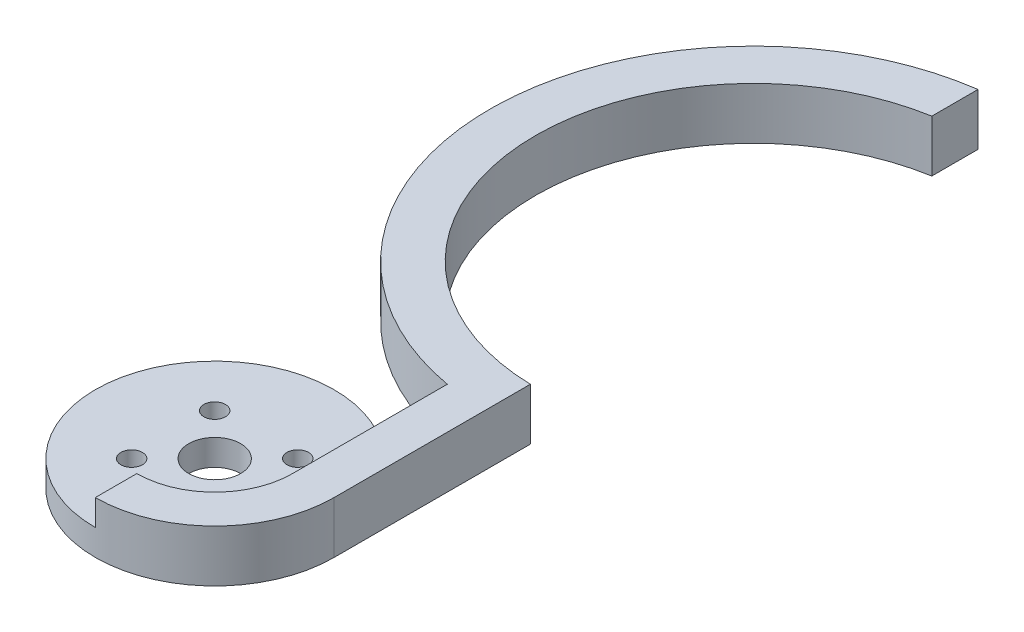
ISO-10303-21;
HEADER;
FILE_DESCRIPTION(('STEP AP214'),'2;1');
FILE_NAME('part.step','',(''),(''),'','','');
FILE_SCHEMA(('AUTOMOTIVE_DESIGN { 1 0 10303 214 1 1 1 1 }'));
ENDSEC;
DATA;
#1=APPLICATION_CONTEXT('core data for automotive mechanical design processes');
#2=APPLICATION_PROTOCOL_DEFINITION('international standard','automotive_design',2000,#1);
#3=PRODUCT_CONTEXT('',#1,'mechanical');
#4=PRODUCT('Part','Part','',(#3));
#5=PRODUCT_RELATED_PRODUCT_CATEGORY('part','',(#4));
#6=PRODUCT_DEFINITION_FORMATION('','',#4);
#7=PRODUCT_DEFINITION_CONTEXT('part definition',#1,'design');
#8=PRODUCT_DEFINITION('design','',#6,#7);
#9=PRODUCT_DEFINITION_SHAPE('','',#8);
#10=(LENGTH_UNIT() NAMED_UNIT(*) SI_UNIT(.MILLI.,.METRE.));
#11=(NAMED_UNIT(*) PLANE_ANGLE_UNIT() SI_UNIT($,.RADIAN.));
#12=(NAMED_UNIT(*) SI_UNIT($,.STERADIAN.) SOLID_ANGLE_UNIT());
#13=UNCERTAINTY_MEASURE_WITH_UNIT(LENGTH_MEASURE(1.E-05),#10,'distance_accuracy_value','');
#14=(GEOMETRIC_REPRESENTATION_CONTEXT(3) GLOBAL_UNCERTAINTY_ASSIGNED_CONTEXT((#13)) GLOBAL_UNIT_ASSIGNED_CONTEXT((#10,
#11,#12)) REPRESENTATION_CONTEXT('',''));
#15=CARTESIAN_POINT('',(0.,0.,0.));
#16=DIRECTION('',(0.,0.,1.));
#17=DIRECTION('',(1.,0.,0.));
#18=AXIS2_PLACEMENT_3D('',#15,#16,#17);
#19=CARTESIAN_POINT('',(15.,5.,0.));
#20=DIRECTION('',(-1.,0.,0.));
#21=DIRECTION('',(0.,0.,1.));
#22=AXIS2_PLACEMENT_3D('',#19,#20,#21);
#23=PLANE('',#22);
#24=DIRECTION('',(0.,0.,-1.));
#25=VECTOR('',#24,1.);
#26=CARTESIAN_POINT('',(15.,0.,0.));
#27=LINE('',#26,#25);
#28=CARTESIAN_POINT('',(15.,0.,-17.4355957741627));
#29=VERTEX_POINT('',#28);
#30=CARTESIAN_POINT('',(15.,0.,-29.8036001296093));
#31=VERTEX_POINT('',#30);
#32=EDGE_CURVE('E155',#29,#31,#27,.T.);
#33=ORIENTED_EDGE('',*,*,#32,.F.);
#34=DIRECTION('',(0.,-1.,0.));
#35=VECTOR('',#34,1.);
#36=CARTESIAN_POINT('',(15.,5.,-17.4355957741627));
#37=LINE('',#36,#35);
#38=CARTESIAN_POINT('',(15.,5.,-17.4355957741627));
#39=VERTEX_POINT('',#38);
#40=EDGE_CURVE('E11',#39,#29,#37,.T.);
#41=ORIENTED_EDGE('',*,*,#40,.F.);
#42=DIRECTION('',(0.,0.,1.));
#43=VECTOR('',#42,1.);
#44=CARTESIAN_POINT('',(15.,5.,0.));
#45=LINE('',#44,#43);
#46=CARTESIAN_POINT('',(15.,5.,0.));
#47=VERTEX_POINT('',#46);
#48=EDGE_CURVE('E153',#39,#47,#45,.T.);
#49=ORIENTED_EDGE('',*,*,#48,.T.);
#50=DIRECTION('',(0.,-1.,0.));
#51=VECTOR('',#50,1.);
#52=CARTESIAN_POINT('',(15.,10.,0.));
#53=LINE('',#52,#51);
#54=CARTESIAN_POINT('',(15.,10.,0.));
#55=VERTEX_POINT('',#54);
#56=EDGE_CURVE('E148',#55,#47,#53,.T.);
#57=ORIENTED_EDGE('',*,*,#56,.F.);
#58=DIRECTION('',(0.,0.,-1.));
#59=VECTOR('',#58,1.);
#60=CARTESIAN_POINT('',(15.,10.,0.));
#61=LINE('',#60,#59);
#62=CARTESIAN_POINT('',(15.,10.,-29.8036001296093));
#63=VERTEX_POINT('',#62);
#64=EDGE_CURVE('E131',#55,#63,#61,.T.);
#65=ORIENTED_EDGE('',*,*,#64,.T.);
#66=DIRECTION('',(0.,-1.,0.));
#67=VECTOR('',#66,1.);
#68=CARTESIAN_POINT('',(15.,5.,-29.8036001296093));
#69=LINE('',#68,#67);
#70=EDGE_CURVE('E174',#63,#31,#69,.T.);
#71=ORIENTED_EDGE('',*,*,#70,.T.);
#72=EDGE_LOOP('',(#33,#41,#49,#57,#65,#71));
#73=FACE_BOUND('',#72,.T.);
#74=ADVANCED_FACE('F35',(#73),#23,.T.);
#75=CARTESIAN_POINT('',(0.,5.,0.));
#76=DIRECTION('',(0.,-1.,0.));
#77=DIRECTION('',(0.,0.,-1.));
#78=AXIS2_PLACEMENT_3D('',#75,#76,#77);
#79=CYLINDRICAL_SURFACE('',#78,23.);
#80=DIRECTION('',(0.,-1.,0.));
#81=VECTOR('',#80,1.);
#82=CARTESIAN_POINT('',(23.,5.,0.));
#83=LINE('',#82,#81);
#84=CARTESIAN_POINT('',(23.,10.,0.));
#85=VERTEX_POINT('',#84);
#86=CARTESIAN_POINT('',(23.,0.,0.));
#87=VERTEX_POINT('',#86);
#88=EDGE_CURVE('E42',#85,#87,#83,.T.);
#89=ORIENTED_EDGE('',*,*,#88,.F.);
#90=CARTESIAN_POINT('',(0.,10.,0.));
#91=DIRECTION('',(0.,1.,0.));
#92=DIRECTION('',(0.,0.,1.));
#93=AXIS2_PLACEMENT_3D('',#90,#91,#92);
#94=CIRCLE('',#93,23.);
#95=CARTESIAN_POINT('',(0.,10.,23.));
#96=VERTEX_POINT('',#95);
#97=EDGE_CURVE('E139',#96,#85,#94,.T.);
#98=ORIENTED_EDGE('',*,*,#97,.F.);
#99=DIRECTION('',(0.,-1.,0.));
#100=VECTOR('',#99,1.);
#101=CARTESIAN_POINT('',(0.,10.,23.));
#102=LINE('',#101,#100);
#103=CARTESIAN_POINT('',(0.,5.,23.));
#104=VERTEX_POINT('',#103);
#105=EDGE_CURVE('E142',#96,#104,#102,.T.);
#106=ORIENTED_EDGE('',*,*,#105,.T.);
#107=CARTESIAN_POINT('',(0.,5.,0.));
#108=DIRECTION('',(0.,1.,0.));
#109=DIRECTION('',(0.,0.,1.));
#110=AXIS2_PLACEMENT_3D('',#107,#108,#109);
#111=CIRCLE('',#110,23.);
#112=EDGE_CURVE('E156',#39,#104,#111,.T.);
#113=ORIENTED_EDGE('',*,*,#112,.F.);
#114=ORIENTED_EDGE('',*,*,#40,.T.);
#115=CARTESIAN_POINT('',(0.,0.,0.));
#116=DIRECTION('',(0.,1.,0.));
#117=DIRECTION('',(0.,0.,1.));
#118=AXIS2_PLACEMENT_3D('',#115,#116,#117);
#119=CIRCLE('',#118,23.);
#120=EDGE_CURVE('E177',#29,#87,#119,.T.);
#121=ORIENTED_EDGE('',*,*,#120,.T.);
#122=EDGE_LOOP('',(#89,#98,#106,#113,#114,#121));
#123=FACE_BOUND('',#122,.T.);
#124=ADVANCED_FACE('F229',(#123),#79,.T.);
#125=CARTESIAN_POINT('',(23.,5.,0.));
#126=DIRECTION('',(-1.,0.,0.));
#127=DIRECTION('',(0.,0.,1.));
#128=AXIS2_PLACEMENT_3D('',#125,#126,#127);
#129=PLANE('',#128);
#130=DIRECTION('',(0.,0.,-1.));
#131=VECTOR('',#130,1.);
#132=CARTESIAN_POINT('',(23.,0.,0.));
#133=LINE('',#132,#131);
#134=CARTESIAN_POINT('',(23.,0.,-37.811906449566));
#135=VERTEX_POINT('',#134);
#136=EDGE_CURVE('E179',#87,#135,#133,.T.);
#137=ORIENTED_EDGE('',*,*,#136,.T.);
#138=DIRECTION('',(0.,-1.,0.));
#139=VECTOR('',#138,1.);
#140=CARTESIAN_POINT('',(23.,5.,-37.811906449566));
#141=LINE('',#140,#139);
#142=CARTESIAN_POINT('',(23.,10.,-37.811906449566));
#143=VERTEX_POINT('',#142);
#144=EDGE_CURVE('E111',#143,#135,#141,.T.);
#145=ORIENTED_EDGE('',*,*,#144,.F.);
#146=DIRECTION('',(0.,0.,-1.));
#147=VECTOR('',#146,1.);
#148=CARTESIAN_POINT('',(23.,10.,0.));
#149=LINE('',#148,#147);
#150=EDGE_CURVE('E127',#85,#143,#149,.T.);
#151=ORIENTED_EDGE('',*,*,#150,.F.);
#152=ORIENTED_EDGE('',*,*,#88,.T.);
#153=EDGE_LOOP('',(#137,#145,#151,#152));
#154=FACE_BOUND('',#153,.T.);
#155=ADVANCED_FACE('F207',(#154),#129,.F.);
#156=CARTESIAN_POINT('',(24.,5.,-79.8));
#157=DIRECTION('',(0.,-1.,0.));
#158=DIRECTION('',(0.,0.,-1.));
#159=AXIS2_PLACEMENT_3D('',#156,#157,#158);
#160=CYLINDRICAL_SURFACE('',#159,42.);
#161=CARTESIAN_POINT('',(24.,0.,-79.8));
#162=DIRECTION('',(0.,1.,0.));
#163=DIRECTION('',(0.,0.,1.));
#164=AXIS2_PLACEMENT_3D('',#161,#162,#163);
#165=CIRCLE('',#164,42.);
#166=CARTESIAN_POINT('',(16.9372197309417,0.,-121.201897720648));
#167=VERTEX_POINT('',#166);
#168=EDGE_CURVE('E108',#167,#135,#165,.T.);
#169=ORIENTED_EDGE('',*,*,#168,.F.);
#170=DIRECTION('',(0.,-1.,0.));
#171=VECTOR('',#170,1.);
#172=CARTESIAN_POINT('',(16.9372197309417,5.,-121.201897720648));
#173=LINE('',#172,#171);
#174=CARTESIAN_POINT('',(16.9372197309417,10.,-121.201897720648));
#175=VERTEX_POINT('',#174);
#176=EDGE_CURVE('E102',#175,#167,#173,.T.);
#177=ORIENTED_EDGE('',*,*,#176,.F.);
#178=CARTESIAN_POINT('',(24.,10.,-79.8));
#179=DIRECTION('',(0.,1.,0.));
#180=DIRECTION('',(0.,0.,1.));
#181=AXIS2_PLACEMENT_3D('',#178,#179,#180);
#182=CIRCLE('',#181,42.);
#183=EDGE_CURVE('E106',#175,#143,#182,.T.);
#184=ORIENTED_EDGE('',*,*,#183,.T.);
#185=ORIENTED_EDGE('',*,*,#144,.T.);
#186=EDGE_LOOP('',(#169,#177,#184,#185));
#187=FACE_BOUND('',#186,.T.);
#188=ADVANCED_FACE('F104',(#187),#160,.F.);
#189=CARTESIAN_POINT('',(16.9372197309417,5.,0.));
#190=DIRECTION('',(-1.,0.,0.));
#191=DIRECTION('',(0.,0.,1.));
#192=AXIS2_PLACEMENT_3D('',#189,#190,#191);
#193=PLANE('',#192);
#194=DIRECTION('',(0.,0.,-1.));
#195=VECTOR('',#194,1.);
#196=CARTESIAN_POINT('',(16.9372197309417,0.,0.));
#197=LINE('',#196,#195);
#198=CARTESIAN_POINT('',(16.9372197309417,0.,-130.106631122259));
#199=VERTEX_POINT('',#198);
#200=EDGE_CURVE('E183',#167,#199,#197,.T.);
#201=ORIENTED_EDGE('',*,*,#200,.T.);
#202=DIRECTION('',(0.,-1.,0.));
#203=VECTOR('',#202,1.);
#204=CARTESIAN_POINT('',(16.9372197309417,5.,-130.106631122259));
#205=LINE('',#204,#203);
#206=CARTESIAN_POINT('',(16.9372197309417,10.,-130.106631122259));
#207=VERTEX_POINT('',#206);
#208=EDGE_CURVE('E112',#207,#199,#205,.T.);
#209=ORIENTED_EDGE('',*,*,#208,.F.);
#210=DIRECTION('',(0.,0.,-1.));
#211=VECTOR('',#210,1.);
#212=CARTESIAN_POINT('',(16.9372197309417,10.,0.));
#213=LINE('',#212,#211);
#214=EDGE_CURVE('E115',#175,#207,#213,.T.);
#215=ORIENTED_EDGE('',*,*,#214,.F.);
#216=ORIENTED_EDGE('',*,*,#176,.T.);
#217=EDGE_LOOP('',(#201,#209,#215,#216));
#218=FACE_BOUND('',#217,.T.);
#219=ADVANCED_FACE('F116',(#218),#193,.F.);
#220=CARTESIAN_POINT('',(8.,5.,8.));
#221=DIRECTION('',(0.,-1.,0.));
#222=DIRECTION('',(0.,0.,-1.));
#223=AXIS2_PLACEMENT_3D('',#220,#221,#222);
#224=CYLINDRICAL_SURFACE('',#223,2.075);
#225=CARTESIAN_POINT('',(8.,5.,8.));
#226=DIRECTION('',(0.,1.,0.));
#227=DIRECTION('',(0.,0.,1.));
#228=AXIS2_PLACEMENT_3D('',#225,#226,#227);
#229=CIRCLE('',#228,2.075);
#230=CARTESIAN_POINT('',(8.,5.,10.075));
#231=VERTEX_POINT('',#230);
#232=EDGE_CURVE('E168',#231,#231,#229,.T.);
#233=ORIENTED_EDGE('',*,*,#232,.T.);
#234=EDGE_LOOP('',(#233));
#235=FACE_BOUND('',#234,.T.);
#236=CARTESIAN_POINT('',(8.,0.,8.));
#237=DIRECTION('',(0.,1.,0.));
#238=DIRECTION('',(0.,0.,1.));
#239=AXIS2_PLACEMENT_3D('',#236,#237,#238);
#240=CIRCLE('',#239,2.075);
#241=CARTESIAN_POINT('',(8.,0.,10.075));
#242=VERTEX_POINT('',#241);
#243=EDGE_CURVE('E197',#242,#242,#240,.T.);
#244=ORIENTED_EDGE('',*,*,#243,.F.);
#245=EDGE_LOOP('',(#244));
#246=FACE_BOUND('',#245,.T.);
#247=ADVANCED_FACE('F241',(#235,#246),#224,.F.);
#248=CARTESIAN_POINT('',(8.,5.,-8.));
#249=DIRECTION('',(0.,-1.,0.));
#250=DIRECTION('',(0.,0.,-1.));
#251=AXIS2_PLACEMENT_3D('',#248,#249,#250);
#252=CYLINDRICAL_SURFACE('',#251,2.075);
#253=CARTESIAN_POINT('',(8.,5.,-8.));
#254=DIRECTION('',(0.,1.,0.));
#255=DIRECTION('',(0.,0.,1.));
#256=AXIS2_PLACEMENT_3D('',#253,#254,#255);
#257=CIRCLE('',#256,2.075);
#258=CARTESIAN_POINT('',(8.,5.,-5.925));
#259=VERTEX_POINT('',#258);
#260=EDGE_CURVE('E165',#259,#259,#257,.T.);
#261=ORIENTED_EDGE('',*,*,#260,.T.);
#262=EDGE_LOOP('',(#261));
#263=FACE_BOUND('',#262,.T.);
#264=CARTESIAN_POINT('',(8.,0.,-8.));
#265=DIRECTION('',(0.,1.,0.));
#266=DIRECTION('',(0.,0.,1.));
#267=AXIS2_PLACEMENT_3D('',#264,#265,#266);
#268=CIRCLE('',#267,2.075);
#269=CARTESIAN_POINT('',(8.,0.,-5.925));
#270=VERTEX_POINT('',#269);
#271=EDGE_CURVE('E194',#270,#270,#268,.T.);
#272=ORIENTED_EDGE('',*,*,#271,.F.);
#273=EDGE_LOOP('',(#272));
#274=FACE_BOUND('',#273,.T.);
#275=ADVANCED_FACE('F252',(#263,#274),#252,.F.);
#276=CARTESIAN_POINT('',(-8.,5.,8.));
#277=DIRECTION('',(0.,-1.,0.));
#278=DIRECTION('',(0.,0.,-1.));
#279=AXIS2_PLACEMENT_3D('',#276,#277,#278);
#280=CYLINDRICAL_SURFACE('',#279,2.075);
#281=CARTESIAN_POINT('',(-8.,5.,8.));
#282=DIRECTION('',(0.,1.,0.));
#283=DIRECTION('',(0.,0.,1.));
#284=AXIS2_PLACEMENT_3D('',#281,#282,#283);
#285=CIRCLE('',#284,2.075);
#286=CARTESIAN_POINT('',(-8.,5.,10.075));
#287=VERTEX_POINT('',#286);
#288=EDGE_CURVE('E162',#287,#287,#285,.T.);
#289=ORIENTED_EDGE('',*,*,#288,.T.);
#290=EDGE_LOOP('',(#289));
#291=FACE_BOUND('',#290,.T.);
#292=CARTESIAN_POINT('',(-8.,0.,8.));
#293=DIRECTION('',(0.,1.,0.));
#294=DIRECTION('',(0.,0.,1.));
#295=AXIS2_PLACEMENT_3D('',#292,#293,#294);
#296=CIRCLE('',#295,2.075);
#297=CARTESIAN_POINT('',(-8.,0.,10.075));
#298=VERTEX_POINT('',#297);
#299=EDGE_CURVE('E191',#298,#298,#296,.T.);
#300=ORIENTED_EDGE('',*,*,#299,.F.);
#301=EDGE_LOOP('',(#300));
#302=FACE_BOUND('',#301,.T.);
#303=ADVANCED_FACE('F248',(#291,#302),#280,.F.);
#304=CARTESIAN_POINT('',(-8.,5.,-8.));
#305=DIRECTION('',(0.,-1.,0.));
#306=DIRECTION('',(0.,0.,-1.));
#307=AXIS2_PLACEMENT_3D('',#304,#305,#306);
#308=CYLINDRICAL_SURFACE('',#307,2.075);
#309=CARTESIAN_POINT('',(-8.,5.,-8.));
#310=DIRECTION('',(0.,1.,0.));
#311=DIRECTION('',(0.,0.,1.));
#312=AXIS2_PLACEMENT_3D('',#309,#310,#311);
#313=CIRCLE('',#312,2.075);
#314=CARTESIAN_POINT('',(-8.,5.,-5.925));
#315=VERTEX_POINT('',#314);
#316=EDGE_CURVE('E158',#315,#315,#313,.T.);
#317=ORIENTED_EDGE('',*,*,#316,.T.);
#318=EDGE_LOOP('',(#317));
#319=FACE_BOUND('',#318,.T.);
#320=CARTESIAN_POINT('',(-8.,0.,-8.));
#321=DIRECTION('',(0.,1.,0.));
#322=DIRECTION('',(0.,0.,1.));
#323=AXIS2_PLACEMENT_3D('',#320,#321,#322);
#324=CIRCLE('',#323,2.075);
#325=CARTESIAN_POINT('',(-8.,0.,-5.925));
#326=VERTEX_POINT('',#325);
#327=EDGE_CURVE('E188',#326,#326,#324,.T.);
#328=ORIENTED_EDGE('',*,*,#327,.F.);
#329=EDGE_LOOP('',(#328));
#330=FACE_BOUND('',#329,.T.);
#331=ADVANCED_FACE('F245',(#319,#330),#308,.F.);
#332=CARTESIAN_POINT('',(24.,5.,-79.8));
#333=DIRECTION('',(0.,-1.,0.));
#334=DIRECTION('',(0.,0.,-1.));
#335=AXIS2_PLACEMENT_3D('',#332,#333,#334);
#336=CYLINDRICAL_SURFACE('',#335,50.8);
#337=CARTESIAN_POINT('',(24.,0.,-79.8));
#338=DIRECTION('',(0.,1.,0.));
#339=DIRECTION('',(0.,0.,1.));
#340=AXIS2_PLACEMENT_3D('',#337,#338,#339);
#341=CIRCLE('',#340,50.8);
#342=EDGE_CURVE('E185',#199,#31,#341,.T.);
#343=ORIENTED_EDGE('',*,*,#342,.T.);
#344=ORIENTED_EDGE('',*,*,#70,.F.);
#345=CARTESIAN_POINT('',(24.,10.,-79.8));
#346=DIRECTION('',(0.,1.,0.));
#347=DIRECTION('',(0.,0.,1.));
#348=AXIS2_PLACEMENT_3D('',#345,#346,#347);
#349=CIRCLE('',#348,50.8);
#350=EDGE_CURVE('E121',#207,#63,#349,.T.);
#351=ORIENTED_EDGE('',*,*,#350,.F.);
#352=ORIENTED_EDGE('',*,*,#208,.T.);
#353=EDGE_LOOP('',(#343,#344,#351,#352));
#354=FACE_BOUND('',#353,.T.);
#355=ADVANCED_FACE('F217',(#354),#336,.T.);
#356=CARTESIAN_POINT('',(0.,5.,0.));
#357=DIRECTION('',(0.,-1.,0.));
#358=DIRECTION('',(0.,0.,-1.));
#359=AXIS2_PLACEMENT_3D('',#356,#357,#358);
#360=CYLINDRICAL_SURFACE('',#359,5.);
#361=CARTESIAN_POINT('',(0.,5.,0.));
#362=DIRECTION('',(0.,1.,0.));
#363=DIRECTION('',(0.,0.,1.));
#364=AXIS2_PLACEMENT_3D('',#361,#362,#363);
#365=CIRCLE('',#364,5.);
#366=CARTESIAN_POINT('',(0.,5.,5.));
#367=VERTEX_POINT('',#366);
#368=EDGE_CURVE('E171',#367,#367,#365,.T.);
#369=ORIENTED_EDGE('',*,*,#368,.T.);
#370=EDGE_LOOP('',(#369));
#371=FACE_BOUND('',#370,.T.);
#372=CARTESIAN_POINT('',(0.,0.,0.));
#373=DIRECTION('',(0.,1.,0.));
#374=DIRECTION('',(0.,0.,1.));
#375=AXIS2_PLACEMENT_3D('',#372,#373,#374);
#376=CIRCLE('',#375,5.);
#377=CARTESIAN_POINT('',(0.,0.,5.));
#378=VERTEX_POINT('',#377);
#379=EDGE_CURVE('E159',#378,#378,#376,.T.);
#380=ORIENTED_EDGE('',*,*,#379,.F.);
#381=EDGE_LOOP('',(#380));
#382=FACE_BOUND('',#381,.T.);
#383=ADVANCED_FACE('F244',(#371,#382),#360,.F.);
#384=CARTESIAN_POINT('',(0.,5.,0.));
#385=DIRECTION('',(0.,1.,0.));
#386=DIRECTION('',(0.,0.,1.));
#387=AXIS2_PLACEMENT_3D('',#384,#385,#386);
#388=PLANE('',#387);
#389=ORIENTED_EDGE('',*,*,#48,.F.);
#390=ORIENTED_EDGE('',*,*,#112,.T.);
#391=DIRECTION('',(0.,0.,-1.));
#392=VECTOR('',#391,1.);
#393=CARTESIAN_POINT('',(0.,5.,0.));
#394=LINE('',#393,#392);
#395=CARTESIAN_POINT('',(0.,5.,15.));
#396=VERTEX_POINT('',#395);
#397=EDGE_CURVE('E54',#104,#396,#394,.T.);
#398=ORIENTED_EDGE('',*,*,#397,.T.);
#399=CARTESIAN_POINT('',(0.,5.,0.));
#400=DIRECTION('',(0.,1.,0.));
#401=DIRECTION('',(0.,0.,1.));
#402=AXIS2_PLACEMENT_3D('',#399,#400,#401);
#403=CIRCLE('',#402,15.);
#404=EDGE_CURVE('E49',#47,#396,#403,.F.);
#405=ORIENTED_EDGE('',*,*,#404,.F.);
#406=EDGE_LOOP('',(#389,#390,#398,#405));
#407=FACE_BOUND('',#406,.T.);
#408=ORIENTED_EDGE('',*,*,#316,.F.);
#409=EDGE_LOOP('',(#408));
#410=FACE_BOUND('',#409,.T.);
#411=ORIENTED_EDGE('',*,*,#288,.F.);
#412=EDGE_LOOP('',(#411));
#413=FACE_BOUND('',#412,.T.);
#414=ORIENTED_EDGE('',*,*,#260,.F.);
#415=EDGE_LOOP('',(#414));
#416=FACE_BOUND('',#415,.T.);
#417=ORIENTED_EDGE('',*,*,#232,.F.);
#418=EDGE_LOOP('',(#417));
#419=FACE_BOUND('',#418,.T.);
#420=ORIENTED_EDGE('',*,*,#368,.F.);
#421=EDGE_LOOP('',(#420));
#422=FACE_BOUND('',#421,.T.);
#423=ADVANCED_FACE('F262',(#407,#410,#413,#416,#419,#422),#388,.T.);
#424=CARTESIAN_POINT('',(0.,0.,0.));
#425=DIRECTION('',(0.,1.,0.));
#426=DIRECTION('',(0.,0.,1.));
#427=AXIS2_PLACEMENT_3D('',#424,#425,#426);
#428=PLANE('',#427);
#429=ORIENTED_EDGE('',*,*,#120,.F.);
#430=ORIENTED_EDGE('',*,*,#32,.T.);
#431=ORIENTED_EDGE('',*,*,#342,.F.);
#432=ORIENTED_EDGE('',*,*,#200,.F.);
#433=ORIENTED_EDGE('',*,*,#168,.T.);
#434=ORIENTED_EDGE('',*,*,#136,.F.);
#435=EDGE_LOOP('',(#429,#430,#431,#432,#433,#434));
#436=FACE_BOUND('',#435,.T.);
#437=ORIENTED_EDGE('',*,*,#327,.T.);
#438=EDGE_LOOP('',(#437));
#439=FACE_BOUND('',#438,.T.);
#440=ORIENTED_EDGE('',*,*,#299,.T.);
#441=EDGE_LOOP('',(#440));
#442=FACE_BOUND('',#441,.T.);
#443=ORIENTED_EDGE('',*,*,#271,.T.);
#444=EDGE_LOOP('',(#443));
#445=FACE_BOUND('',#444,.T.);
#446=ORIENTED_EDGE('',*,*,#243,.T.);
#447=EDGE_LOOP('',(#446));
#448=FACE_BOUND('',#447,.T.);
#449=ORIENTED_EDGE('',*,*,#379,.T.);
#450=EDGE_LOOP('',(#449));
#451=FACE_BOUND('',#450,.T.);
#452=ADVANCED_FACE('F212',(#436,#439,#442,#445,#448,#451),#428,.F.);
#453=CARTESIAN_POINT('',(0.,10.,0.));
#454=DIRECTION('',(0.,-1.,0.));
#455=DIRECTION('',(0.,0.,-1.));
#456=AXIS2_PLACEMENT_3D('',#453,#454,#455);
#457=CYLINDRICAL_SURFACE('',#456,15.);
#458=ORIENTED_EDGE('',*,*,#56,.T.);
#459=ORIENTED_EDGE('',*,*,#404,.T.);
#460=DIRECTION('',(0.,-1.,0.));
#461=VECTOR('',#460,1.);
#462=CARTESIAN_POINT('',(0.,10.,15.));
#463=LINE('',#462,#461);
#464=CARTESIAN_POINT('',(0.,10.,15.));
#465=VERTEX_POINT('',#464);
#466=EDGE_CURVE('E145',#465,#396,#463,.T.);
#467=ORIENTED_EDGE('',*,*,#466,.F.);
#468=CARTESIAN_POINT('',(0.,10.,0.));
#469=DIRECTION('',(0.,1.,0.));
#470=DIRECTION('',(0.,0.,1.));
#471=AXIS2_PLACEMENT_3D('',#468,#469,#470);
#472=CIRCLE('',#471,15.);
#473=EDGE_CURVE('E134',#465,#55,#472,.T.);
#474=ORIENTED_EDGE('',*,*,#473,.T.);
#475=EDGE_LOOP('',(#458,#459,#467,#474));
#476=FACE_BOUND('',#475,.T.);
#477=ADVANCED_FACE('F223',(#476),#457,.F.);
#478=CARTESIAN_POINT('',(0.,10.,0.));
#479=DIRECTION('',(1.,0.,0.));
#480=DIRECTION('',(0.,0.,-1.));
#481=AXIS2_PLACEMENT_3D('',#478,#479,#480);
#482=PLANE('',#481);
#483=ORIENTED_EDGE('',*,*,#397,.F.);
#484=ORIENTED_EDGE('',*,*,#105,.F.);
#485=DIRECTION('',(0.,0.,1.));
#486=VECTOR('',#485,1.);
#487=CARTESIAN_POINT('',(0.,10.,0.));
#488=LINE('',#487,#486);
#489=EDGE_CURVE('E137',#465,#96,#488,.T.);
#490=ORIENTED_EDGE('',*,*,#489,.F.);
#491=ORIENTED_EDGE('',*,*,#466,.T.);
#492=EDGE_LOOP('',(#483,#484,#490,#491));
#493=FACE_BOUND('',#492,.T.);
#494=ADVANCED_FACE('F227',(#493),#482,.F.);
#495=CARTESIAN_POINT('',(0.,10.,0.));
#496=DIRECTION('',(0.,1.,0.));
#497=DIRECTION('',(0.,0.,1.));
#498=AXIS2_PLACEMENT_3D('',#495,#496,#497);
#499=PLANE('',#498);
#500=ORIENTED_EDGE('',*,*,#183,.F.);
#501=ORIENTED_EDGE('',*,*,#214,.T.);
#502=ORIENTED_EDGE('',*,*,#350,.T.);
#503=ORIENTED_EDGE('',*,*,#64,.F.);
#504=ORIENTED_EDGE('',*,*,#473,.F.);
#505=ORIENTED_EDGE('',*,*,#489,.T.);
#506=ORIENTED_EDGE('',*,*,#97,.T.);
#507=ORIENTED_EDGE('',*,*,#150,.T.);
#508=EDGE_LOOP('',(#500,#501,#502,#503,#504,#505,#506,#507));
#509=FACE_BOUND('',#508,.T.);
#510=ADVANCED_FACE('F124',(#509),#499,.T.);
#511=CLOSED_SHELL('',(#74,#124,#155,#188,#219,#247,#275,#303,#331,#355,#383,#423,#452,#477,#494,#510));
#512=MANIFOLD_SOLID_BREP('B2',#511);
#513=ADVANCED_BREP_SHAPE_REPRESENTATION('',(#18,#512),#14);
#514=SHAPE_DEFINITION_REPRESENTATION(#9,#513);
ENDSEC;
END-ISO-10303-21;
